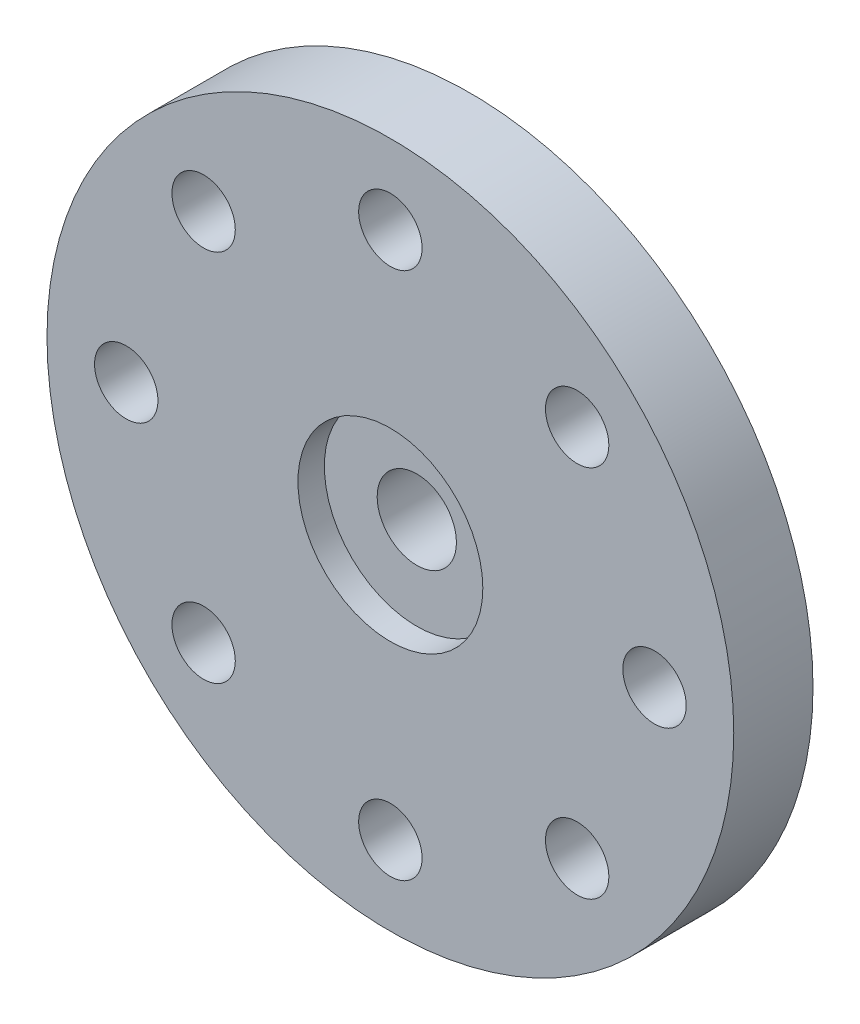
ISO-10303-21;
HEADER;
FILE_DESCRIPTION(('STEP AP214'),'2;1');
FILE_NAME('part.step','',(''),(''),'','','');
FILE_SCHEMA(('AUTOMOTIVE_DESIGN { 1 0 10303 214 1 1 1 1 }'));
ENDSEC;
DATA;
#1=APPLICATION_CONTEXT('core data for automotive mechanical design processes');
#2=APPLICATION_PROTOCOL_DEFINITION('international standard','automotive_design',2000,#1);
#3=PRODUCT_CONTEXT('',#1,'mechanical');
#4=PRODUCT('Part','Part','',(#3));
#5=PRODUCT_RELATED_PRODUCT_CATEGORY('part','',(#4));
#6=PRODUCT_DEFINITION_FORMATION('','',#4);
#7=PRODUCT_DEFINITION_CONTEXT('part definition',#1,'design');
#8=PRODUCT_DEFINITION('design','',#6,#7);
#9=PRODUCT_DEFINITION_SHAPE('','',#8);
#10=(LENGTH_UNIT() NAMED_UNIT(*) SI_UNIT(.MILLI.,.METRE.));
#11=(NAMED_UNIT(*) PLANE_ANGLE_UNIT() SI_UNIT($,.RADIAN.));
#12=(NAMED_UNIT(*) SI_UNIT($,.STERADIAN.) SOLID_ANGLE_UNIT());
#13=UNCERTAINTY_MEASURE_WITH_UNIT(LENGTH_MEASURE(1.E-05),#10,'distance_accuracy_value','');
#14=(GEOMETRIC_REPRESENTATION_CONTEXT(3) GLOBAL_UNCERTAINTY_ASSIGNED_CONTEXT((#13)) GLOBAL_UNIT_ASSIGNED_CONTEXT((#10,
#11,#12)) REPRESENTATION_CONTEXT('',''));
#15=CARTESIAN_POINT('',(0.,0.,0.));
#16=DIRECTION('',(0.,0.,1.));
#17=DIRECTION('',(1.,0.,0.));
#18=AXIS2_PLACEMENT_3D('',#15,#16,#17);
#19=CARTESIAN_POINT('',(0.,0.,0.));
#20=DIRECTION('',(0.,0.,1.));
#21=DIRECTION('',(1.,0.,0.));
#22=AXIS2_PLACEMENT_3D('',#19,#20,#21);
#23=PLANE('',#22);
#24=CARTESIAN_POINT('',(0.,0.,0.));
#25=DIRECTION('',(0.,0.,1.));
#26=DIRECTION('',(1.,0.,0.));
#27=AXIS2_PLACEMENT_3D('',#24,#25,#26);
#28=CIRCLE('',#27,3.5);
#29=CARTESIAN_POINT('',(3.5,0.,0.));
#30=VERTEX_POINT('',#29);
#31=EDGE_CURVE('E10',#30,#30,#28,.T.);
#32=ORIENTED_EDGE('',*,*,#31,.T.);
#33=EDGE_LOOP('',(#32));
#34=FACE_BOUND('',#33,.T.);
#35=CARTESIAN_POINT('',(0.,0.,0.));
#36=DIRECTION('',(0.,0.,1.));
#37=DIRECTION('',(1.,0.,0.));
#38=AXIS2_PLACEMENT_3D('',#35,#36,#37);
#39=CIRCLE('',#38,13.);
#40=CARTESIAN_POINT('',(13.,0.,0.));
#41=VERTEX_POINT('',#40);
#42=EDGE_CURVE('E55',#41,#41,#39,.T.);
#43=ORIENTED_EDGE('',*,*,#42,.F.);
#44=EDGE_LOOP('',(#43));
#45=FACE_BOUND('',#44,.T.);
#46=CARTESIAN_POINT('',(-7.07106781186549,7.07106781186546,0.));
#47=DIRECTION('',(0.,0.,1.));
#48=DIRECTION('',(1.,0.,0.));
#49=AXIS2_PLACEMENT_3D('',#46,#47,#48);
#50=CIRCLE('',#49,1.2);
#51=CARTESIAN_POINT('',(-5.87106781186549,7.07106781186546,0.));
#52=VERTEX_POINT('',#51);
#53=EDGE_CURVE('E64',#52,#52,#50,.T.);
#54=ORIENTED_EDGE('',*,*,#53,.T.);
#55=EDGE_LOOP('',(#54));
#56=FACE_BOUND('',#55,.T.);
#57=CARTESIAN_POINT('',(-10.,0.,0.));
#58=DIRECTION('',(0.,0.,1.));
#59=DIRECTION('',(1.,0.,0.));
#60=AXIS2_PLACEMENT_3D('',#57,#58,#59);
#61=CIRCLE('',#60,1.2);
#62=CARTESIAN_POINT('',(-8.8,0.,0.));
#63=VERTEX_POINT('',#62);
#64=EDGE_CURVE('E100',#63,#63,#61,.T.);
#65=ORIENTED_EDGE('',*,*,#64,.T.);
#66=EDGE_LOOP('',(#65));
#67=FACE_BOUND('',#66,.T.);
#68=CARTESIAN_POINT('',(-7.07106781186546,-7.07106781186549,0.));
#69=DIRECTION('',(0.,0.,1.));
#70=DIRECTION('',(1.,0.,0.));
#71=AXIS2_PLACEMENT_3D('',#68,#69,#70);
#72=CIRCLE('',#71,1.2);
#73=CARTESIAN_POINT('',(-5.87106781186546,-7.07106781186549,0.));
#74=VERTEX_POINT('',#73);
#75=EDGE_CURVE('E107',#74,#74,#72,.T.);
#76=ORIENTED_EDGE('',*,*,#75,.T.);
#77=EDGE_LOOP('',(#76));
#78=FACE_BOUND('',#77,.T.);
#79=CARTESIAN_POINT('',(0.,-10.,0.));
#80=DIRECTION('',(0.,0.,1.));
#81=DIRECTION('',(1.,0.,0.));
#82=AXIS2_PLACEMENT_3D('',#79,#80,#81);
#83=CIRCLE('',#82,1.2);
#84=CARTESIAN_POINT('',(1.2,-10.,0.));
#85=VERTEX_POINT('',#84);
#86=EDGE_CURVE('E77',#85,#85,#83,.T.);
#87=ORIENTED_EDGE('',*,*,#86,.T.);
#88=EDGE_LOOP('',(#87));
#89=FACE_BOUND('',#88,.T.);
#90=CARTESIAN_POINT('',(7.07106781186549,-7.07106781186546,0.));
#91=DIRECTION('',(0.,0.,1.));
#92=DIRECTION('',(1.,0.,0.));
#93=AXIS2_PLACEMENT_3D('',#90,#91,#92);
#94=CIRCLE('',#93,1.2);
#95=CARTESIAN_POINT('',(8.27106781186549,-7.07106781186546,0.));
#96=VERTEX_POINT('',#95);
#97=EDGE_CURVE('E76',#96,#96,#94,.T.);
#98=ORIENTED_EDGE('',*,*,#97,.T.);
#99=EDGE_LOOP('',(#98));
#100=FACE_BOUND('',#99,.T.);
#101=CARTESIAN_POINT('',(10.,0.,0.));
#102=DIRECTION('',(0.,0.,1.));
#103=DIRECTION('',(1.,0.,0.));
#104=AXIS2_PLACEMENT_3D('',#101,#102,#103);
#105=CIRCLE('',#104,1.2);
#106=CARTESIAN_POINT('',(11.2,0.,0.));
#107=VERTEX_POINT('',#106);
#108=EDGE_CURVE('E83',#107,#107,#105,.T.);
#109=ORIENTED_EDGE('',*,*,#108,.T.);
#110=EDGE_LOOP('',(#109));
#111=FACE_BOUND('',#110,.T.);
#112=CARTESIAN_POINT('',(7.07106781186546,7.07106781186549,0.));
#113=DIRECTION('',(0.,0.,1.));
#114=DIRECTION('',(1.,0.,0.));
#115=AXIS2_PLACEMENT_3D('',#112,#113,#114);
#116=CIRCLE('',#115,1.2);
#117=CARTESIAN_POINT('',(8.27106781186546,7.07106781186549,0.));
#118=VERTEX_POINT('',#117);
#119=EDGE_CURVE('E89',#118,#118,#116,.T.);
#120=ORIENTED_EDGE('',*,*,#119,.T.);
#121=EDGE_LOOP('',(#120));
#122=FACE_BOUND('',#121,.T.);
#123=CARTESIAN_POINT('',(0.,10.,0.));
#124=DIRECTION('',(0.,0.,1.));
#125=DIRECTION('',(1.,0.,0.));
#126=AXIS2_PLACEMENT_3D('',#123,#124,#125);
#127=CIRCLE('',#126,1.2);
#128=CARTESIAN_POINT('',(1.2,10.,0.));
#129=VERTEX_POINT('',#128);
#130=EDGE_CURVE('E70',#129,#129,#127,.T.);
#131=ORIENTED_EDGE('',*,*,#130,.T.);
#132=EDGE_LOOP('',(#131));
#133=FACE_BOUND('',#132,.T.);
#134=ADVANCED_FACE('F37',(#34,#45,#56,#67,#78,#89,#100,#111,#122,#133),#23,.F.);
#135=CARTESIAN_POINT('',(0.,0.,3.));
#136=DIRECTION('',(0.,0.,-1.));
#137=DIRECTION('',(-1.,0.,0.));
#138=AXIS2_PLACEMENT_3D('',#135,#136,#137);
#139=CYLINDRICAL_SURFACE('',#138,1.5);
#140=CARTESIAN_POINT('',(0.,0.,2.));
#141=DIRECTION('',(0.,0.,1.));
#142=DIRECTION('',(1.,0.,0.));
#143=AXIS2_PLACEMENT_3D('',#140,#141,#142);
#144=CIRCLE('',#143,1.5);
#145=CARTESIAN_POINT('',(1.5,0.,2.));
#146=VERTEX_POINT('',#145);
#147=EDGE_CURVE('E52',#146,#146,#144,.T.);
#148=ORIENTED_EDGE('',*,*,#147,.T.);
#149=EDGE_LOOP('',(#148));
#150=FACE_BOUND('',#149,.T.);
#151=CARTESIAN_POINT('',(0.,0.,-1.));
#152=DIRECTION('',(0.,0.,-1.));
#153=DIRECTION('',(-1.,0.,0.));
#154=AXIS2_PLACEMENT_3D('',#151,#152,#153);
#155=CIRCLE('',#154,1.5);
#156=CARTESIAN_POINT('',(-1.5,0.,-1.));
#157=VERTEX_POINT('',#156);
#158=EDGE_CURVE('E101',#157,#157,#155,.T.);
#159=ORIENTED_EDGE('',*,*,#158,.T.);
#160=EDGE_LOOP('',(#159));
#161=FACE_BOUND('',#160,.T.);
#162=ADVANCED_FACE('F135',(#150,#161),#139,.F.);
#163=CARTESIAN_POINT('',(0.,0.,3.));
#164=DIRECTION('',(0.,0.,1.));
#165=DIRECTION('',(1.,0.,0.));
#166=AXIS2_PLACEMENT_3D('',#163,#164,#165);
#167=PLANE('',#166);
#168=CARTESIAN_POINT('',(0.,10.,3.));
#169=DIRECTION('',(0.,0.,1.));
#170=DIRECTION('',(1.,0.,0.));
#171=AXIS2_PLACEMENT_3D('',#168,#169,#170);
#172=CIRCLE('',#171,1.2);
#173=CARTESIAN_POINT('',(1.2,10.,3.));
#174=VERTEX_POINT('',#173);
#175=EDGE_CURVE('E92',#174,#174,#172,.T.);
#176=ORIENTED_EDGE('',*,*,#175,.F.);
#177=EDGE_LOOP('',(#176));
#178=FACE_BOUND('',#177,.T.);
#179=CARTESIAN_POINT('',(7.07106781186546,7.07106781186549,3.));
#180=DIRECTION('',(0.,0.,1.));
#181=DIRECTION('',(1.,0.,0.));
#182=AXIS2_PLACEMENT_3D('',#179,#180,#181);
#183=CIRCLE('',#182,1.2);
#184=CARTESIAN_POINT('',(8.27106781186546,7.07106781186549,3.));
#185=VERTEX_POINT('',#184);
#186=EDGE_CURVE('E86',#185,#185,#183,.T.);
#187=ORIENTED_EDGE('',*,*,#186,.F.);
#188=EDGE_LOOP('',(#187));
#189=FACE_BOUND('',#188,.T.);
#190=CARTESIAN_POINT('',(10.,0.,3.));
#191=DIRECTION('',(0.,0.,1.));
#192=DIRECTION('',(1.,0.,0.));
#193=AXIS2_PLACEMENT_3D('',#190,#191,#192);
#194=CIRCLE('',#193,1.2);
#195=CARTESIAN_POINT('',(11.2,0.,3.));
#196=VERTEX_POINT('',#195);
#197=EDGE_CURVE('E80',#196,#196,#194,.T.);
#198=ORIENTED_EDGE('',*,*,#197,.F.);
#199=EDGE_LOOP('',(#198));
#200=FACE_BOUND('',#199,.T.);
#201=CARTESIAN_POINT('',(7.07106781186549,-7.07106781186546,3.));
#202=DIRECTION('',(0.,0.,1.));
#203=DIRECTION('',(1.,0.,0.));
#204=AXIS2_PLACEMENT_3D('',#201,#202,#203);
#205=CIRCLE('',#204,1.2);
#206=CARTESIAN_POINT('',(8.27106781186549,-7.07106781186546,3.));
#207=VERTEX_POINT('',#206);
#208=EDGE_CURVE('E73',#207,#207,#205,.T.);
#209=ORIENTED_EDGE('',*,*,#208,.F.);
#210=EDGE_LOOP('',(#209));
#211=FACE_BOUND('',#210,.T.);
#212=CARTESIAN_POINT('',(0.,-10.,3.));
#213=DIRECTION('',(0.,0.,1.));
#214=DIRECTION('',(1.,0.,0.));
#215=AXIS2_PLACEMENT_3D('',#212,#213,#214);
#216=CIRCLE('',#215,1.2);
#217=CARTESIAN_POINT('',(1.2,-10.,3.));
#218=VERTEX_POINT('',#217);
#219=EDGE_CURVE('E110',#218,#218,#216,.T.);
#220=ORIENTED_EDGE('',*,*,#219,.F.);
#221=EDGE_LOOP('',(#220));
#222=FACE_BOUND('',#221,.T.);
#223=CARTESIAN_POINT('',(-7.07106781186546,-7.07106781186549,3.));
#224=DIRECTION('',(0.,0.,1.));
#225=DIRECTION('',(1.,0.,0.));
#226=AXIS2_PLACEMENT_3D('',#223,#224,#225);
#227=CIRCLE('',#226,1.2);
#228=CARTESIAN_POINT('',(-5.87106781186546,-7.07106781186549,3.));
#229=VERTEX_POINT('',#228);
#230=EDGE_CURVE('E104',#229,#229,#227,.T.);
#231=ORIENTED_EDGE('',*,*,#230,.F.);
#232=EDGE_LOOP('',(#231));
#233=FACE_BOUND('',#232,.T.);
#234=CARTESIAN_POINT('',(-10.,0.,3.));
#235=DIRECTION('',(0.,0.,1.));
#236=DIRECTION('',(1.,0.,0.));
#237=AXIS2_PLACEMENT_3D('',#234,#235,#236);
#238=CIRCLE('',#237,1.2);
#239=CARTESIAN_POINT('',(-8.8,0.,3.));
#240=VERTEX_POINT('',#239);
#241=EDGE_CURVE('E97',#240,#240,#238,.T.);
#242=ORIENTED_EDGE('',*,*,#241,.F.);
#243=EDGE_LOOP('',(#242));
#244=FACE_BOUND('',#243,.T.);
#245=CARTESIAN_POINT('',(-7.07106781186549,7.07106781186546,3.));
#246=DIRECTION('',(0.,0.,1.));
#247=DIRECTION('',(1.,0.,0.));
#248=AXIS2_PLACEMENT_3D('',#245,#246,#247);
#249=CIRCLE('',#248,1.2);
#250=CARTESIAN_POINT('',(-5.87106781186549,7.07106781186546,3.));
#251=VERTEX_POINT('',#250);
#252=EDGE_CURVE('E67',#251,#251,#249,.T.);
#253=ORIENTED_EDGE('',*,*,#252,.F.);
#254=EDGE_LOOP('',(#253));
#255=FACE_BOUND('',#254,.T.);
#256=CARTESIAN_POINT('',(0.,0.,3.));
#257=DIRECTION('',(0.,0.,1.));
#258=DIRECTION('',(1.,0.,0.));
#259=AXIS2_PLACEMENT_3D('',#256,#257,#258);
#260=CIRCLE('',#259,3.5);
#261=CARTESIAN_POINT('',(3.5,0.,3.));
#262=VERTEX_POINT('',#261);
#263=EDGE_CURVE('E61',#262,#262,#260,.T.);
#264=ORIENTED_EDGE('',*,*,#263,.F.);
#265=EDGE_LOOP('',(#264));
#266=FACE_BOUND('',#265,.T.);
#267=CARTESIAN_POINT('',(0.,0.,3.));
#268=DIRECTION('',(0.,0.,1.));
#269=DIRECTION('',(1.,0.,0.));
#270=AXIS2_PLACEMENT_3D('',#267,#268,#269);
#271=CIRCLE('',#270,13.);
#272=CARTESIAN_POINT('',(13.,0.,3.));
#273=VERTEX_POINT('',#272);
#274=EDGE_CURVE('E49',#273,#273,#271,.T.);
#275=ORIENTED_EDGE('',*,*,#274,.T.);
#276=EDGE_LOOP('',(#275));
#277=FACE_BOUND('',#276,.T.);
#278=ADVANCED_FACE('F140',(#178,#189,#200,#211,#222,#233,#244,#255,#266,#277),#167,.T.);
#279=CARTESIAN_POINT('',(0.,0.,3.));
#280=DIRECTION('',(0.,0.,-1.));
#281=DIRECTION('',(-1.,0.,0.));
#282=AXIS2_PLACEMENT_3D('',#279,#280,#281);
#283=CYLINDRICAL_SURFACE('',#282,13.);
#284=ORIENTED_EDGE('',*,*,#274,.F.);
#285=EDGE_LOOP('',(#284));
#286=FACE_BOUND('',#285,.T.);
#287=ORIENTED_EDGE('',*,*,#42,.T.);
#288=EDGE_LOOP('',(#287));
#289=FACE_BOUND('',#288,.T.);
#290=ADVANCED_FACE('F146',(#286,#289),#283,.T.);
#291=CARTESIAN_POINT('',(0.,0.,2.));
#292=DIRECTION('',(0.,0.,1.));
#293=DIRECTION('',(1.,0.,0.));
#294=AXIS2_PLACEMENT_3D('',#291,#292,#293);
#295=CYLINDRICAL_SURFACE('',#294,3.5);
#296=CARTESIAN_POINT('',(0.,0.,2.));
#297=DIRECTION('',(0.,0.,1.));
#298=DIRECTION('',(1.,0.,0.));
#299=AXIS2_PLACEMENT_3D('',#296,#297,#298);
#300=CIRCLE('',#299,3.5);
#301=CARTESIAN_POINT('',(3.5,0.,2.));
#302=VERTEX_POINT('',#301);
#303=EDGE_CURVE('E56',#302,#302,#300,.T.);
#304=ORIENTED_EDGE('',*,*,#303,.F.);
#305=EDGE_LOOP('',(#304));
#306=FACE_BOUND('',#305,.T.);
#307=ORIENTED_EDGE('',*,*,#263,.T.);
#308=EDGE_LOOP('',(#307));
#309=FACE_BOUND('',#308,.T.);
#310=ADVANCED_FACE('F148',(#306,#309),#295,.F.);
#311=CARTESIAN_POINT('',(0.,0.,2.));
#312=DIRECTION('',(0.,0.,1.));
#313=DIRECTION('',(1.,0.,0.));
#314=AXIS2_PLACEMENT_3D('',#311,#312,#313);
#315=PLANE('',#314);
#316=ORIENTED_EDGE('',*,*,#147,.F.);
#317=EDGE_LOOP('',(#316));
#318=FACE_BOUND('',#317,.T.);
#319=ORIENTED_EDGE('',*,*,#303,.T.);
#320=EDGE_LOOP('',(#319));
#321=FACE_BOUND('',#320,.T.);
#322=ADVANCED_FACE('F154',(#318,#321),#315,.T.);
#323=CARTESIAN_POINT('',(-7.07106781186549,7.07106781186546,0.));
#324=DIRECTION('',(0.,0.,1.));
#325=DIRECTION('',(1.,0.,0.));
#326=AXIS2_PLACEMENT_3D('',#323,#324,#325);
#327=CYLINDRICAL_SURFACE('',#326,1.2);
#328=ORIENTED_EDGE('',*,*,#53,.F.);
#329=EDGE_LOOP('',(#328));
#330=FACE_BOUND('',#329,.T.);
#331=ORIENTED_EDGE('',*,*,#252,.T.);
#332=EDGE_LOOP('',(#331));
#333=FACE_BOUND('',#332,.T.);
#334=ADVANCED_FACE('F202',(#330,#333),#327,.F.);
#335=CARTESIAN_POINT('',(-10.,0.,0.));
#336=DIRECTION('',(0.,0.,1.));
#337=DIRECTION('',(1.,0.,0.));
#338=AXIS2_PLACEMENT_3D('',#335,#336,#337);
#339=CYLINDRICAL_SURFACE('',#338,1.2);
#340=ORIENTED_EDGE('',*,*,#64,.F.);
#341=EDGE_LOOP('',(#340));
#342=FACE_BOUND('',#341,.T.);
#343=ORIENTED_EDGE('',*,*,#241,.T.);
#344=EDGE_LOOP('',(#343));
#345=FACE_BOUND('',#344,.T.);
#346=ADVANCED_FACE('F204',(#342,#345),#339,.F.);
#347=CARTESIAN_POINT('',(-7.07106781186546,-7.07106781186549,0.));
#348=DIRECTION('',(0.,0.,1.));
#349=DIRECTION('',(1.,0.,0.));
#350=AXIS2_PLACEMENT_3D('',#347,#348,#349);
#351=CYLINDRICAL_SURFACE('',#350,1.2);
#352=ORIENTED_EDGE('',*,*,#75,.F.);
#353=EDGE_LOOP('',(#352));
#354=FACE_BOUND('',#353,.T.);
#355=ORIENTED_EDGE('',*,*,#230,.T.);
#356=EDGE_LOOP('',(#355));
#357=FACE_BOUND('',#356,.T.);
#358=ADVANCED_FACE('F211',(#354,#357),#351,.F.);
#359=CARTESIAN_POINT('',(0.,-10.,0.));
#360=DIRECTION('',(0.,0.,1.));
#361=DIRECTION('',(1.,0.,0.));
#362=AXIS2_PLACEMENT_3D('',#359,#360,#361);
#363=CYLINDRICAL_SURFACE('',#362,1.2);
#364=ORIENTED_EDGE('',*,*,#86,.F.);
#365=EDGE_LOOP('',(#364));
#366=FACE_BOUND('',#365,.T.);
#367=ORIENTED_EDGE('',*,*,#219,.T.);
#368=EDGE_LOOP('',(#367));
#369=FACE_BOUND('',#368,.T.);
#370=ADVANCED_FACE('F221',(#366,#369),#363,.F.);
#371=CARTESIAN_POINT('',(7.07106781186549,-7.07106781186546,0.));
#372=DIRECTION('',(0.,0.,1.));
#373=DIRECTION('',(1.,0.,0.));
#374=AXIS2_PLACEMENT_3D('',#371,#372,#373);
#375=CYLINDRICAL_SURFACE('',#374,1.2);
#376=ORIENTED_EDGE('',*,*,#97,.F.);
#377=EDGE_LOOP('',(#376));
#378=FACE_BOUND('',#377,.T.);
#379=ORIENTED_EDGE('',*,*,#208,.T.);
#380=EDGE_LOOP('',(#379));
#381=FACE_BOUND('',#380,.T.);
#382=ADVANCED_FACE('F217',(#378,#381),#375,.F.);
#383=CARTESIAN_POINT('',(10.,0.,0.));
#384=DIRECTION('',(0.,0.,1.));
#385=DIRECTION('',(1.,0.,0.));
#386=AXIS2_PLACEMENT_3D('',#383,#384,#385);
#387=CYLINDRICAL_SURFACE('',#386,1.2);
#388=ORIENTED_EDGE('',*,*,#108,.F.);
#389=EDGE_LOOP('',(#388));
#390=FACE_BOUND('',#389,.T.);
#391=ORIENTED_EDGE('',*,*,#197,.T.);
#392=EDGE_LOOP('',(#391));
#393=FACE_BOUND('',#392,.T.);
#394=ADVANCED_FACE('F220',(#390,#393),#387,.F.);
#395=CARTESIAN_POINT('',(7.07106781186546,7.07106781186549,0.));
#396=DIRECTION('',(0.,0.,1.));
#397=DIRECTION('',(1.,0.,0.));
#398=AXIS2_PLACEMENT_3D('',#395,#396,#397);
#399=CYLINDRICAL_SURFACE('',#398,1.2);
#400=ORIENTED_EDGE('',*,*,#119,.F.);
#401=EDGE_LOOP('',(#400));
#402=FACE_BOUND('',#401,.T.);
#403=ORIENTED_EDGE('',*,*,#186,.T.);
#404=EDGE_LOOP('',(#403));
#405=FACE_BOUND('',#404,.T.);
#406=ADVANCED_FACE('F180',(#402,#405),#399,.F.);
#407=CARTESIAN_POINT('',(0.,10.,0.));
#408=DIRECTION('',(0.,0.,1.));
#409=DIRECTION('',(1.,0.,0.));
#410=AXIS2_PLACEMENT_3D('',#407,#408,#409);
#411=CYLINDRICAL_SURFACE('',#410,1.2);
#412=ORIENTED_EDGE('',*,*,#130,.F.);
#413=EDGE_LOOP('',(#412));
#414=FACE_BOUND('',#413,.T.);
#415=ORIENTED_EDGE('',*,*,#175,.T.);
#416=EDGE_LOOP('',(#415));
#417=FACE_BOUND('',#416,.T.);
#418=ADVANCED_FACE('F131',(#414,#417),#411,.F.);
#419=CARTESIAN_POINT('',(0.,0.,-1.));
#420=DIRECTION('',(0.,0.,-1.));
#421=DIRECTION('',(-1.,0.,0.));
#422=AXIS2_PLACEMENT_3D('',#419,#420,#421);
#423=PLANE('',#422);
#424=CARTESIAN_POINT('',(0.,0.,-1.));
#425=DIRECTION('',(0.,0.,-1.));
#426=DIRECTION('',(-1.,0.,0.));
#427=AXIS2_PLACEMENT_3D('',#424,#425,#426);
#428=CIRCLE('',#427,2.5);
#429=CARTESIAN_POINT('',(-2.5,0.,-1.));
#430=VERTEX_POINT('',#429);
#431=EDGE_CURVE('E45',#430,#430,#428,.T.);
#432=ORIENTED_EDGE('',*,*,#431,.T.);
#433=EDGE_LOOP('',(#432));
#434=FACE_BOUND('',#433,.T.);
#435=ORIENTED_EDGE('',*,*,#158,.F.);
#436=EDGE_LOOP('',(#435));
#437=FACE_BOUND('',#436,.T.);
#438=ADVANCED_FACE('F125',(#434,#437),#423,.T.);
#439=CARTESIAN_POINT('',(0.,0.,-0.5));
#440=DIRECTION('',(0.,0.,1.));
#441=DIRECTION('',(1.,0.,0.));
#442=AXIS2_PLACEMENT_3D('',#439,#440,#441);
#443=TOROIDAL_SURFACE('',#442,3.5,0.5);
#444=ORIENTED_EDGE('',*,*,#31,.F.);
#445=EDGE_LOOP('',(#444));
#446=FACE_BOUND('',#445,.T.);
#447=CARTESIAN_POINT('',(0.,0.,-0.5));
#448=DIRECTION('',(0.,0.,1.));
#449=DIRECTION('',(1.,0.,0.));
#450=AXIS2_PLACEMENT_3D('',#447,#448,#449);
#451=CIRCLE('',#450,3.);
#452=CARTESIAN_POINT('',(3.,0.,-0.5));
#453=VERTEX_POINT('',#452);
#454=EDGE_CURVE('E41',#453,#453,#451,.F.);
#455=ORIENTED_EDGE('',*,*,#454,.F.);
#456=EDGE_LOOP('',(#455));
#457=FACE_BOUND('',#456,.T.);
#458=ADVANCED_FACE('F39',(#446,#457),#443,.F.);
#459=CARTESIAN_POINT('',(0.,0.,-0.5));
#460=DIRECTION('',(0.,0.,-1.));
#461=DIRECTION('',(-1.,0.,0.));
#462=AXIS2_PLACEMENT_3D('',#459,#460,#461);
#463=TOROIDAL_SURFACE('',#462,2.5,0.5);
#464=ORIENTED_EDGE('',*,*,#454,.T.);
#465=EDGE_LOOP('',(#464));
#466=FACE_BOUND('',#465,.T.);
#467=ORIENTED_EDGE('',*,*,#431,.F.);
#468=EDGE_LOOP('',(#467));
#469=FACE_BOUND('',#468,.T.);
#470=ADVANCED_FACE('F121',(#466,#469),#463,.T.);
#471=CLOSED_SHELL('',(#134,#162,#278,#290,#310,#322,#334,#346,#358,#370,#382,#394,#406,#418,
#438,#458,#470));
#472=MANIFOLD_SOLID_BREP('B2',#471);
#473=ADVANCED_BREP_SHAPE_REPRESENTATION('',(#18,#472),#14);
#474=SHAPE_DEFINITION_REPRESENTATION(#9,#473);
ENDSEC;
END-ISO-10303-21;
